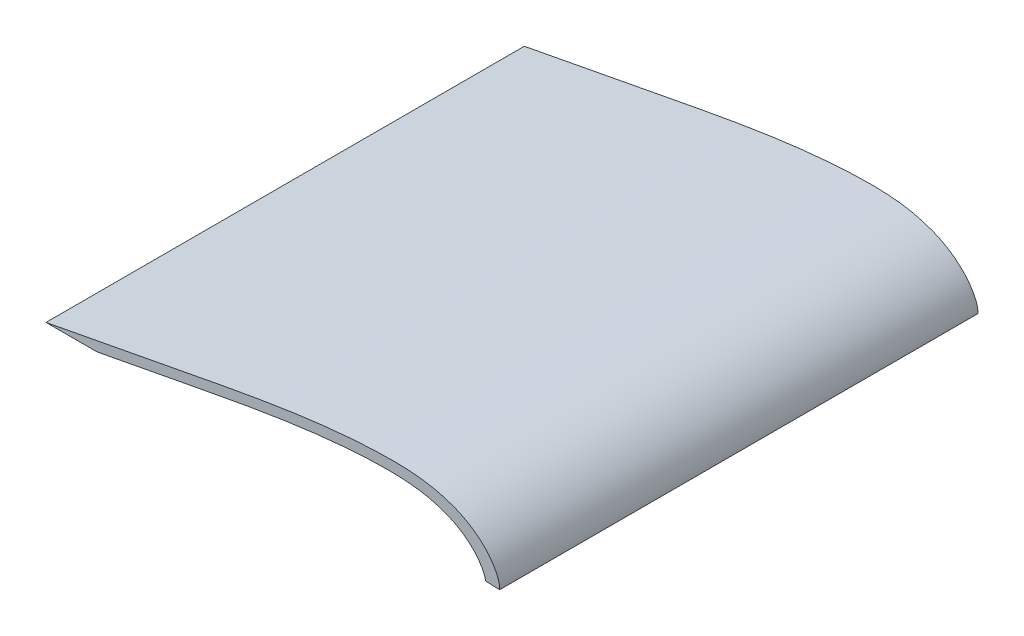
ISO-10303-21;
HEADER;
FILE_DESCRIPTION(('STEP AP214'),'2;1');
FILE_NAME('part.step','',(''),(''),'','','');
FILE_SCHEMA(('AUTOMOTIVE_DESIGN { 1 0 10303 214 1 1 1 1 }'));
ENDSEC;
DATA;
#1=APPLICATION_CONTEXT('core data for automotive mechanical design processes');
#2=APPLICATION_PROTOCOL_DEFINITION('international standard','automotive_design',2000,#1);
#3=PRODUCT_CONTEXT('',#1,'mechanical');
#4=PRODUCT('Part','Part','',(#3));
#5=PRODUCT_RELATED_PRODUCT_CATEGORY('part','',(#4));
#6=PRODUCT_DEFINITION_FORMATION('','',#4);
#7=PRODUCT_DEFINITION_CONTEXT('part definition',#1,'design');
#8=PRODUCT_DEFINITION('design','',#6,#7);
#9=PRODUCT_DEFINITION_SHAPE('','',#8);
#10=(LENGTH_UNIT() NAMED_UNIT(*) SI_UNIT(.MILLI.,.METRE.));
#11=(NAMED_UNIT(*) PLANE_ANGLE_UNIT() SI_UNIT($,.RADIAN.));
#12=(NAMED_UNIT(*) SI_UNIT($,.STERADIAN.) SOLID_ANGLE_UNIT());
#13=UNCERTAINTY_MEASURE_WITH_UNIT(LENGTH_MEASURE(1.E-05),#10,'distance_accuracy_value','');
#14=(GEOMETRIC_REPRESENTATION_CONTEXT(3) GLOBAL_UNCERTAINTY_ASSIGNED_CONTEXT((#13)) GLOBAL_UNIT_ASSIGNED_CONTEXT((#10,
#11,#12)) REPRESENTATION_CONTEXT('',''));
#15=CARTESIAN_POINT('',(0.,0.,0.));
#16=DIRECTION('',(0.,0.,1.));
#17=DIRECTION('',(1.,0.,0.));
#18=AXIS2_PLACEMENT_3D('',#15,#16,#17);
#19=CARTESIAN_POINT('',(0.,0.978621832348302,50.));
#20=DIRECTION('',(0.,-1.,0.));
#21=DIRECTION('',(1.,0.,0.));
#22=AXIS2_PLACEMENT_3D('',#19,#20,#21);
#23=PLANE('',#22);
#24=DIRECTION('',(-1.,0.,0.));
#25=VECTOR('',#24,1.);
#26=CARTESIAN_POINT('',(0.,0.978621832348302,-50.));
#27=LINE('',#26,#25);
#28=CARTESIAN_POINT('',(-35.4155003882221,0.978621832348296,-50.));
#29=VERTEX_POINT('',#28);
#30=CARTESIAN_POINT('',(-46.1269689717631,0.978621832348294,-50.));
#31=VERTEX_POINT('',#30);
#32=EDGE_CURVE('E109',#29,#31,#27,.T.);
#33=ORIENTED_EDGE('',*,*,#32,.F.);
#34=DIRECTION('',(0.,0.,-1.));
#35=VECTOR('',#34,1.);
#36=CARTESIAN_POINT('',(-35.4155003882221,0.978621832348296,50.));
#37=LINE('',#36,#35);
#38=CARTESIAN_POINT('',(-35.4155003882221,0.978621832348296,50.));
#39=VERTEX_POINT('',#38);
#40=EDGE_CURVE('E11',#39,#29,#37,.T.);
#41=ORIENTED_EDGE('',*,*,#40,.F.);
#42=DIRECTION('',(-1.,0.,0.));
#43=VECTOR('',#42,1.);
#44=CARTESIAN_POINT('',(0.,0.978621832348302,50.));
#45=LINE('',#44,#43);
#46=CARTESIAN_POINT('',(-46.1269689717631,0.978621832348294,50.));
#47=VERTEX_POINT('',#46);
#48=EDGE_CURVE('E91',#39,#47,#45,.T.);
#49=ORIENTED_EDGE('',*,*,#48,.T.);
#50=DIRECTION('',(0.,0.,-1.));
#51=VECTOR('',#50,1.);
#52=CARTESIAN_POINT('',(-46.1269689717631,0.978621832348294,50.));
#53=LINE('',#52,#51);
#54=EDGE_CURVE('E80',#47,#31,#53,.T.);
#55=ORIENTED_EDGE('',*,*,#54,.T.);
#56=EDGE_LOOP('',(#33,#41,#49,#55));
#57=FACE_BOUND('',#56,.T.);
#58=ADVANCED_FACE('F41',(#57),#23,.T.);
#59=CARTESIAN_POINT('',(-35.4155003882221,0.978621832348296,50.));
#60=CARTESIAN_POINT('',(-31.9007173370773,1.64635628416153,50.));
#61=CARTESIAN_POINT('',(-28.3856698058971,2.3126448778515,50.));
#62=CARTESIAN_POINT('',(-21.3562508178817,3.64891802505001,50.));
#63=CARTESIAN_POINT('',(-17.8425754911761,4.3227081792385,50.));
#64=CARTESIAN_POINT('',(-10.8122623329176,5.65409308106331,50.));
#65=CARTESIAN_POINT('',(-7.29606650944638,6.3141041962508,50.));
#66=CARTESIAN_POINT('',(-0.246237666937349,7.53880085388031,50.));
#67=CARTESIAN_POINT('',(3.28965238831914,8.10092736864592,50.));
#68=CARTESIAN_POINT('',(10.3825939062802,9.05560755958679,50.));
#69=CARTESIAN_POINT('',(13.9396556372091,9.44993128258674,50.));
#70=CARTESIAN_POINT('',(19.2947793828201,9.84598529877852,50.));
#71=CARTESIAN_POINT('',(21.0805341764407,9.94564859009441,50.));
#72=CARTESIAN_POINT('',(24.6540542042394,10.0538145286358,50.));
#73=CARTESIAN_POINT('',(26.4418124960493,10.0626319679296,50.));
#74=CARTESIAN_POINT('',(29.1266398806134,9.93121440272804,50.));
#75=CARTESIAN_POINT('',(30.0211426646081,9.86253180617185,50.));
#76=CARTESIAN_POINT('',(31.793464097941,9.65608484297072,50.));
#77=CARTESIAN_POINT('',(32.6728326635426,9.51756510191342,50.));
#78=CARTESIAN_POINT('',(34.4149632249248,9.15422751018887,50.));
#79=CARTESIAN_POINT('',(35.2779300317,8.9304739853783,50.));
#80=CARTESIAN_POINT('',(36.5586522207257,8.5235043255177,50.));
#81=CARTESIAN_POINT('',(36.9844848613411,8.3755582260794,50.));
#82=CARTESIAN_POINT('',(37.8234910137626,8.05637966784077,50.));
#83=CARTESIAN_POINT('',(38.6499420382026,7.71337174188249,50.));
#84=CARTESIAN_POINT('',(39.4456058317382,7.31193030195583,50.));
#85=CARTESIAN_POINT('',(40.2226247444065,6.87510127196028,50.));
#86=CARTESIAN_POINT('',(40.6019011367286,6.63916259648856,50.));
#87=CARTESIAN_POINT('',(41.3430348679903,6.13422425015035,50.));
#88=CARTESIAN_POINT('',(41.7065771372966,5.86440325875697,50.));
#89=CARTESIAN_POINT('',(42.4050975818294,5.29900942864422,50.));
#90=CARTESIAN_POINT('',(42.7404354190773,5.00270787099087,50.));
#91=CARTESIAN_POINT('',(43.3790396374764,4.37876524760581,50.));
#92=CARTESIAN_POINT('',(43.6828545053455,4.05166015080139,50.));
#93=CARTESIAN_POINT('',(44.2483702108183,3.35629707072127,50.));
#94=CARTESIAN_POINT('',(44.5091093181837,2.98367906409147,50.));
#95=CARTESIAN_POINT('',(44.864883627484,2.40534334857502,50.));
#96=CARTESIAN_POINT('',(44.9779872625424,2.20959398690504,50.));
#97=CARTESIAN_POINT('',(45.1939946475139,1.81257361418332,50.));
#98=CARTESIAN_POINT('',(45.2964451830852,1.61105725814508,50.));
#99=CARTESIAN_POINT('',(45.4811307024665,1.19708097294938,50.));
#100=CARTESIAN_POINT('',(45.5635723297641,0.983774864354236,50.));
#101=CARTESIAN_POINT('',(45.6905821473474,0.549932416107321,50.));
#102=CARTESIAN_POINT('',(45.7355392161152,0.328490722260033,50.));
#103=CARTESIAN_POINT('',(45.7527208505078,0.100279614292406,50.));
#104=B_SPLINE_CURVE_WITH_KNOTS('',3,(#59,#60,#61,#62,#63,#64,#65,#66,#67,#68,#69,#70,#71,#72,
#73,#74,#75,#76,#77,#78,#79,#80,#81,#82,#83,#84,#85,#86,#87,#88,#89,#90,#91,#92,#93,#94,#95,#96,
#97,#98,#99,#100,#101,#102,#103),.UNSPECIFIED.,.F.,.F.,(4,2,2,2,2,2,2,2,2,2,2,2,1,2,2,2,2,2,2,2,
2,2,4),(0.,0.125,0.25,0.375,0.5,0.625,0.6875,0.75,0.78125,0.8125,0.84375,0.859375,0.875,
0.890625,0.90625,0.921875,0.9375,0.953125,0.96875,0.9765625,0.984375,0.9921875,1.),.UNSPECIFIED.);
#105=DIRECTION('',(0.,0.,-1.));
#106=VECTOR('',#105,1.);
#107=SURFACE_OF_LINEAR_EXTRUSION('',#104,#106);
#108=CARTESIAN_POINT('',(-13.2792701395057,5.18667984495389,-4.89999999999999));
#109=CARTESIAN_POINT('',(-13.5582378660273,5.13397641149939,-4.89998824114871));
#110=CARTESIAN_POINT('',(-13.8373961015732,5.08117268224034,-4.87610393290239));
#111=CARTESIAN_POINT('',(-14.3880719474885,4.97692631034668,-4.78108779745486));
#112=CARTESIAN_POINT('',(-14.6595798550001,4.92548540070697,-4.70989855781385));
#113=CARTESIAN_POINT('',(-15.1869599265857,4.82547865828556,-4.52206002530446));
#114=CARTESIAN_POINT('',(-15.4428338392134,4.77691250400147,-4.40541582706324));
#115=CARTESIAN_POINT('',(-15.9314165585316,4.68411771628761,-4.12974299143327));
#116=CARTESIAN_POINT('',(-16.1641319625704,4.6398878475992,-3.970726472732));
#117=CARTESIAN_POINT('',(-16.5977599840269,4.5574324068113,-3.61600095980994));
#118=CARTESIAN_POINT('',(-16.7989105789687,4.51916192361433,-3.42059351665633));
#119=CARTESIAN_POINT('',(-17.1654534131722,4.44940090664218,-2.99764418007407));
#120=CARTESIAN_POINT('',(-17.330847349518,4.41791005109233,-2.77010381258746));
#121=CARTESIAN_POINT('',(-17.6181744332678,4.36319137106151,-2.29347619149444));
#122=CARTESIAN_POINT('',(-17.7407960541633,4.3398326627328,-2.04481901367112));
#123=CARTESIAN_POINT('',(-17.9425337067278,4.30139817703947,-1.52984417542433));
#124=CARTESIAN_POINT('',(-18.0216541422941,4.28632156122694,-1.26352830576077));
#125=CARTESIAN_POINT('',(-18.1329546371241,4.26511197076907,-0.725312577544871));
#126=CARTESIAN_POINT('',(-18.1658549157874,4.25884177172993,-0.453566898115503));
#127=CARTESIAN_POINT('',(-18.186000808098,4.25500239398807,0.0916655325322689));
#128=CARTESIAN_POINT('',(-18.1732490733454,4.25743270993444,0.365152181709126));
#129=CARTESIAN_POINT('',(-18.1027670013263,4.27086462734465,0.903968829614987));
#130=CARTESIAN_POINT('',(-18.0453713747227,4.2818024451149,1.1693443177488));
#131=CARTESIAN_POINT('',(-17.8877996977759,4.31182632936758,1.68657891053517));
#132=CARTESIAN_POINT('',(-17.7876233623127,4.33091245015588,1.93843792509209));
#133=CARTESIAN_POINT('',(-17.5470598654508,4.37673543150041,2.42267617209285));
#134=CARTESIAN_POINT('',(-17.4065106116814,4.40350313223904,2.65497189858349));
#135=CARTESIAN_POINT('',(-17.0895777474768,4.46384327370599,3.09266504863448));
#136=CARTESIAN_POINT('',(-16.9131919728226,4.49741612540686,3.29806084643685));
#137=CARTESIAN_POINT('',(-16.5270800105377,4.570874469002,3.67917228197775));
#138=CARTESIAN_POINT('',(-16.3169321456056,4.61083976812489,3.85444520171077));
#139=CARTESIAN_POINT('',(-15.8711156552545,4.69557300251991,4.16731551927659));
#140=CARTESIAN_POINT('',(-15.6354447519018,4.74034136646272,4.30490955039136));
#141=CARTESIAN_POINT('',(-15.1409109015208,4.83421190515628,4.54099657275173));
#142=CARTESIAN_POINT('',(-14.881718051139,4.8833755107241,4.63877422307195));
#143=CARTESIAN_POINT('',(-14.3509880406559,4.98395320345979,4.78931345196921));
#144=CARTESIAN_POINT('',(-14.0794498709428,5.03536747467636,4.84207134178829));
#145=CARTESIAN_POINT('',(-13.5278459318931,5.13971727020196,4.90165100845156));
#146=CARTESIAN_POINT('',(-13.2477146675762,5.19266394535014,4.90784842739502));
#147=CARTESIAN_POINT('',(-12.6903411741331,5.29786458421039,4.87248894222003));
#148=CARTESIAN_POINT('',(-12.4130990566631,5.35011852117146,4.83093019933692));
#149=CARTESIAN_POINT('',(-11.8683560659781,5.45261360959477,4.70085264401336));
#150=CARTESIAN_POINT('',(-11.6008941303717,5.50284678162927,4.61216421706125));
#151=CARTESIAN_POINT('',(-11.0845356329764,5.59963428981457,4.39000301833081));
#152=CARTESIAN_POINT('',(-10.8356385350834,5.6461887321998,4.25653154038265));
#153=CARTESIAN_POINT('',(-10.3656858371074,5.7339071810612,3.94957854313736));
#154=CARTESIAN_POINT('',(-10.1444253668393,5.77511095530248,3.7764222366728));
#155=CARTESIAN_POINT('',(-9.73416794451757,5.85135747256019,3.394233835991));
#156=CARTESIAN_POINT('',(-9.54516835180756,5.88640071984254,3.18520468089291));
#157=CARTESIAN_POINT('',(-9.20799094239719,5.94880826487042,2.74067472167256));
#158=CARTESIAN_POINT('',(-9.05922238021198,5.9762838111547,2.50563766971706));
#159=CARTESIAN_POINT('',(-8.80332547353379,6.02348111623782,2.01318028895523));
#160=CARTESIAN_POINT('',(-8.69619313035803,6.04320361962988,1.75576211250714));
#161=CARTESIAN_POINT('',(-8.52834638876151,6.0740780589275,1.23028028638847));
#162=CARTESIAN_POINT('',(-8.4669179145678,6.0853618560177,0.962452342869722));
#163=CARTESIAN_POINT('',(-8.38963368904596,6.09955515729526,0.420087256604169));
#164=CARTESIAN_POINT('',(-8.37377500106707,6.10246520111186,0.145550547339863));
#165=CARTESIAN_POINT('',(-8.38805942457665,6.09984294334618,-0.399639390175988));
#166=CARTESIAN_POINT('',(-8.41776356539655,6.09439120260348,-0.670304634342462));
#167=CARTESIAN_POINT('',(-8.52143221268221,6.07534547004839,-1.20271735496028));
#168=CARTESIAN_POINT('',(-8.59539622444414,6.06175156924301,-1.4644649310521));
#169=CARTESIAN_POINT('',(-8.78534111810889,6.0267887633809,-1.97180241538893));
#170=CARTESIAN_POINT('',(-8.90133985737986,6.0054165538939,-2.21738540405341));
#171=CARTESIAN_POINT('',(-9.17182938833109,5.95548509817186,-2.68551969672683));
#172=CARTESIAN_POINT('',(-9.32632017380358,5.92692585309592,-2.90807100445018));
#173=CARTESIAN_POINT('',(-9.6709530275643,5.86307929115366,-3.32628922403478));
#174=CARTESIAN_POINT('',(-9.86143549555745,5.8277276750546,-3.52166567569352));
#175=CARTESIAN_POINT('',(-10.2715240965625,5.75144604211911,-3.87778787476842));
#176=CARTESIAN_POINT('',(-10.4911396112656,5.71051422817802,-4.03852242253124));
#177=CARTESIAN_POINT('',(-10.9570177325765,5.62349186671397,-4.3235351484654));
#178=CARTESIAN_POINT('',(-11.2036582058446,5.57732774026196,-4.44717237809415));
#179=CARTESIAN_POINT('',(-11.7134004671176,5.4817232353523,-4.65115779503187));
#180=CARTESIAN_POINT('',(-11.9764841228919,5.43228646226929,-4.73155275820307));
#181=CARTESIAN_POINT('',(-12.4141314734336,5.34990617184319,-4.82616564345606));
#182=CARTESIAN_POINT('',(-12.5860131095919,5.31751795157748,-4.85382337844951));
#183=CARTESIAN_POINT('',(-12.9316618715679,5.2523260877219,-4.89074430984593));
#184=CARTESIAN_POINT('',(-13.1054290156781,5.21952244010117,-4.9000073276287));
#185=CARTESIAN_POINT('',(-13.2792701395057,5.18667984495389,-4.89999999999999));
#186=B_SPLINE_CURVE_WITH_KNOTS('',3,(#108,#109,#110,#111,#112,#113,#114,#115,#116,#117,#118,
#119,#120,#121,#122,#123,#124,#125,#126,#127,#128,#129,#130,#131,#132,#133,#134,#135,#136,#137,
#138,#139,#140,#141,#142,#143,#144,#145,#146,#147,#148,#149,#150,#151,#152,#153,#154,#155,#156,
#157,#158,#159,#160,#161,#162,#163,#164,#165,#166,#167,#168,#169,#170,#171,#172,#173,#174,#175,
#176,#177,#178,#179,#180,#181,#182,#183,#184,#185),.UNSPECIFIED.,.T.,.F.,(4,2,2,2,2,2,2,2,2,2,2,
2,2,2,2,2,2,2,2,2,2,2,2,2,2,2,2,2,2,2,2,2,2,2,2,2,2,2,4),(0.,0.851066972016037,1.70316874720835,
2.55517504562554,3.40693792720399,4.25193373195981,5.09688942267957,5.92753804166074,
6.75810255339284,7.57557567140816,8.39300130900654,9.20435680969015,10.0157177178878,
10.8303827951912,11.6450970859203,12.4709163857348,13.2968094508408,14.1369473850339,
14.977154150513,15.8286079888824,16.6800946120406,17.5346666034676,18.3892139075228,
19.2369939856707,20.0847046369897,20.9191929264346,21.7536010530046,22.5746816572003,
23.3957093473655,24.2088764632463,25.022034490321,25.835538372342,26.6490421231658,
27.470664322854,28.2925517540978,29.1279148482882,29.9623724900299,30.492717000037,
31.0230666598799),.UNSPECIFIED.);
#187=CARTESIAN_POINT('',(-13.2792701395057,5.18667984495389,-4.89999999999999));
#188=VERTEX_POINT('',#187);
#189=EDGE_CURVE('E130',#188,#188,#186,.T.);
#190=ORIENTED_EDGE('',*,*,#189,.T.);
#191=EDGE_LOOP('',(#190));
#192=FACE_BOUND('',#191,.T.);
#193=CARTESIAN_POINT('',(-35.4155003882221,0.978621832348296,-50.));
#194=CARTESIAN_POINT('',(-31.9007173370773,1.64635628416153,-50.));
#195=CARTESIAN_POINT('',(-28.3856698058971,2.3126448778515,-50.));
#196=CARTESIAN_POINT('',(-21.3562508178817,3.64891802505001,-50.));
#197=CARTESIAN_POINT('',(-17.8425754911761,4.3227081792385,-50.));
#198=CARTESIAN_POINT('',(-10.8122623329176,5.65409308106331,-50.));
#199=CARTESIAN_POINT('',(-7.29606650944638,6.3141041962508,-50.));
#200=CARTESIAN_POINT('',(-0.246237666937349,7.53880085388031,-50.));
#201=CARTESIAN_POINT('',(3.28965238831914,8.10092736864592,-50.));
#202=CARTESIAN_POINT('',(10.3825939062802,9.05560755958679,-50.));
#203=CARTESIAN_POINT('',(13.9396556372091,9.44993128258674,-50.));
#204=CARTESIAN_POINT('',(19.2947793828201,9.84598529877852,-50.));
#205=CARTESIAN_POINT('',(21.0805341764407,9.94564859009441,-50.));
#206=CARTESIAN_POINT('',(24.6540542042394,10.0538145286358,-50.));
#207=CARTESIAN_POINT('',(26.4418124960493,10.0626319679296,-50.));
#208=CARTESIAN_POINT('',(29.1266398806134,9.93121440272804,-50.));
#209=CARTESIAN_POINT('',(30.0211426646081,9.86253180617185,-50.));
#210=CARTESIAN_POINT('',(31.793464097941,9.65608484297072,-50.));
#211=CARTESIAN_POINT('',(32.6728326635426,9.51756510191342,-50.));
#212=CARTESIAN_POINT('',(34.4149632249248,9.15422751018887,-50.));
#213=CARTESIAN_POINT('',(35.2779300317,8.9304739853783,-50.));
#214=CARTESIAN_POINT('',(36.5586522207257,8.5235043255177,-50.));
#215=CARTESIAN_POINT('',(36.9844848613411,8.3755582260794,-50.));
#216=CARTESIAN_POINT('',(37.8234910137626,8.05637966784077,-50.));
#217=CARTESIAN_POINT('',(38.6499420382026,7.71337174188249,-50.));
#218=CARTESIAN_POINT('',(39.4456058317382,7.31193030195583,-50.));
#219=CARTESIAN_POINT('',(40.2226247444065,6.87510127196028,-50.));
#220=CARTESIAN_POINT('',(40.6019011367286,6.63916259648856,-50.));
#221=CARTESIAN_POINT('',(41.3430348679903,6.13422425015035,-50.));
#222=CARTESIAN_POINT('',(41.7065771372966,5.86440325875697,-50.));
#223=CARTESIAN_POINT('',(42.4050975818294,5.29900942864422,-50.));
#224=CARTESIAN_POINT('',(42.7404354190773,5.00270787099087,-50.));
#225=CARTESIAN_POINT('',(43.3790396374764,4.37876524760581,-50.));
#226=CARTESIAN_POINT('',(43.6828545053455,4.05166015080139,-50.));
#227=CARTESIAN_POINT('',(44.2483702108183,3.35629707072127,-50.));
#228=CARTESIAN_POINT('',(44.5091093181837,2.98367906409147,-50.));
#229=CARTESIAN_POINT('',(44.864883627484,2.40534334857502,-50.));
#230=CARTESIAN_POINT('',(44.9779872625424,2.20959398690504,-50.));
#231=CARTESIAN_POINT('',(45.1939946475139,1.81257361418332,-50.));
#232=CARTESIAN_POINT('',(45.2964451830852,1.61105725814508,-50.));
#233=CARTESIAN_POINT('',(45.4811307024665,1.19708097294938,-50.));
#234=CARTESIAN_POINT('',(45.5635723297641,0.983774864354236,-50.));
#235=CARTESIAN_POINT('',(45.6905821473474,0.549932416107321,-50.));
#236=CARTESIAN_POINT('',(45.7355392161152,0.328490722260033,-50.));
#237=CARTESIAN_POINT('',(45.7527208505078,0.100279614292406,-50.));
#238=B_SPLINE_CURVE_WITH_KNOTS('',3,(#193,#194,#195,#196,#197,#198,#199,#200,#201,#202,#203,
#204,#205,#206,#207,#208,#209,#210,#211,#212,#213,#214,#215,#216,#217,#218,#219,#220,#221,#222,
#223,#224,#225,#226,#227,#228,#229,#230,#231,#232,#233,#234,#235,#236,#237),.UNSPECIFIED.,.F.,
.F.,(4,2,2,2,2,2,2,2,2,2,2,2,1,2,2,2,2,2,2,2,2,2,4),(0.,0.125,0.25,0.375,0.5,0.625,0.6875,0.75,
0.78125,0.8125,0.84375,0.859375,0.875,0.890625,0.90625,0.921875,0.9375,0.953125,0.96875,
0.9765625,0.984375,0.9921875,1.),.UNSPECIFIED.);
#239=CARTESIAN_POINT('',(45.7527208505078,0.100279614292406,-50.));
#240=VERTEX_POINT('',#239);
#241=EDGE_CURVE('E96',#29,#240,#238,.T.);
#242=ORIENTED_EDGE('',*,*,#241,.T.);
#243=DIRECTION('',(0.,0.,-1.));
#244=VECTOR('',#243,1.);
#245=CARTESIAN_POINT('',(45.7527208505078,0.100279614292406,50.));
#246=LINE('',#245,#244);
#247=CARTESIAN_POINT('',(45.7527208505078,0.100279614292406,50.));
#248=VERTEX_POINT('',#247);
#249=EDGE_CURVE('E49',#248,#240,#246,.T.);
#250=ORIENTED_EDGE('',*,*,#249,.F.);
#251=EDGE_CURVE('E86',#39,#248,#104,.T.);
#252=ORIENTED_EDGE('',*,*,#251,.F.);
#253=ORIENTED_EDGE('',*,*,#40,.T.);
#254=EDGE_LOOP('',(#242,#250,#252,#253));
#255=FACE_BOUND('',#254,.T.);
#256=ADVANCED_FACE('F94',(#192,#255),#107,.F.);
#257=CARTESIAN_POINT('',(0.0555537243133296,1.64424200734838,50.));
#258=DIRECTION('',(0.0337675612923491,0.999429713288717,0.));
#259=DIRECTION('',(-0.999429713288717,0.0337675612923491,0.));
#260=AXIS2_PLACEMENT_3D('',#257,#258,#259);
#261=PLANE('',#260);
#262=DIRECTION('',(0.999429713288717,-0.0337675612923491,0.));
#263=VECTOR('',#262,1.);
#264=CARTESIAN_POINT('',(0.0555537243133296,1.64424200734838,-50.));
#265=LINE('',#264,#263);
#266=CARTESIAN_POINT('',(48.7207298604943,0.,-50.));
#267=VERTEX_POINT('',#266);
#268=EDGE_CURVE('E73',#240,#267,#265,.T.);
#269=ORIENTED_EDGE('',*,*,#268,.T.);
#270=DIRECTION('',(0.,0.,-1.));
#271=VECTOR('',#270,1.);
#272=CARTESIAN_POINT('',(48.7207298604943,0.,50.));
#273=LINE('',#272,#271);
#274=CARTESIAN_POINT('',(48.7207298604943,0.,50.));
#275=VERTEX_POINT('',#274);
#276=EDGE_CURVE('E97',#275,#267,#273,.T.);
#277=ORIENTED_EDGE('',*,*,#276,.F.);
#278=DIRECTION('',(0.999429713288717,-0.0337675612923491,0.));
#279=VECTOR('',#278,1.);
#280=CARTESIAN_POINT('',(0.0555537243133296,1.64424200734838,50.));
#281=LINE('',#280,#279);
#282=EDGE_CURVE('E90',#248,#275,#281,.T.);
#283=ORIENTED_EDGE('',*,*,#282,.F.);
#284=ORIENTED_EDGE('',*,*,#249,.T.);
#285=EDGE_LOOP('',(#269,#277,#283,#284));
#286=FACE_BOUND('',#285,.T.);
#287=ADVANCED_FACE('F98',(#286),#261,.F.);
#288=CARTESIAN_POINT('',(48.7207298604943,0.,50.));
#289=CARTESIAN_POINT('',(48.741252965423,1.21195926307834,50.));
#290=CARTESIAN_POINT('',(48.0463572006375,2.85721534173638,50.));
#291=CARTESIAN_POINT('',(46.8151058611346,4.78389107983521,50.));
#292=CARTESIAN_POINT('',(45.4925176332466,6.30238205119,50.));
#293=CARTESIAN_POINT('',(43.8268432539271,7.74081065836544,50.));
#294=CARTESIAN_POINT('',(41.4946226029745,9.26430075591071,50.));
#295=CARTESIAN_POINT('',(38.168076464808,10.7171785821723,50.));
#296=CARTESIAN_POINT('',(33.7886927897657,11.8315306531659,50.));
#297=CARTESIAN_POINT('',(28.7294325889155,12.2558988315068,50.));
#298=CARTESIAN_POINT('',(23.7170466796589,12.2188082758978,50.));
#299=CARTESIAN_POINT('',(17.0390176954906,11.8575866468183,50.));
#300=CARTESIAN_POINT('',(8.69027623430045,10.9742714344733,50.));
#301=CARTESIAN_POINT('',(-1.3040851260052,9.44788699290187,50.));
#302=CARTESIAN_POINT('',(-11.2876607345756,7.61115292207958,50.));
#303=CARTESIAN_POINT('',(-21.2786207253422,5.6967215857554,50.));
#304=CARTESIAN_POINT('',(-34.6130364156148,3.16885227616305,50.));
#305=CARTESIAN_POINT('',(-44.6123870014512,1.26557386191845,50.));
#306=CARTESIAN_POINT('',(-51.2792701395057,0.,50.));
#307=B_SPLINE_CURVE_WITH_KNOTS('',3,(#288,#289,#290,#291,#292,#293,#294,#295,#296,#297,#298,
#299,#300,#301,#302,#303,#304,#305,#306),.UNSPECIFIED.,.F.,.F.,(4,1,1,1,1,1,1,1,1,1,1,1,1,1,1,1,
4),(0.,0.0326267587867305,0.0498828709177647,0.0642758902282802,0.0892508134624014,
0.111667997889211,0.142584384450054,0.19113550060581,0.23834039164428,0.285329254589513,
0.332381603589846,0.426846936625918,0.521876030882482,0.617364059993791,0.713023044995343,
0.808682029996895,1.),.UNSPECIFIED.);
#308=DIRECTION('',(0.,0.,-1.));
#309=VECTOR('',#308,1.);
#310=SURFACE_OF_LINEAR_EXTRUSION('',#307,#309);
#311=CARTESIAN_POINT('',(48.7207298604943,0.,-50.));
#312=CARTESIAN_POINT('',(48.741252965423,1.21195926307834,-50.));
#313=CARTESIAN_POINT('',(48.0463572006375,2.85721534173638,-50.));
#314=CARTESIAN_POINT('',(46.8151058611346,4.78389107983521,-50.));
#315=CARTESIAN_POINT('',(45.4925176332466,6.30238205119,-50.));
#316=CARTESIAN_POINT('',(43.8268432539271,7.74081065836544,-50.));
#317=CARTESIAN_POINT('',(41.4946226029745,9.26430075591071,-50.));
#318=CARTESIAN_POINT('',(38.168076464808,10.7171785821723,-50.));
#319=CARTESIAN_POINT('',(33.7886927897657,11.8315306531659,-50.));
#320=CARTESIAN_POINT('',(28.7294325889155,12.2558988315068,-50.));
#321=CARTESIAN_POINT('',(23.7170466796589,12.2188082758978,-50.));
#322=CARTESIAN_POINT('',(17.0390176954906,11.8575866468183,-50.));
#323=CARTESIAN_POINT('',(8.69027623430045,10.9742714344733,-50.));
#324=CARTESIAN_POINT('',(-1.3040851260052,9.44788699290187,-50.));
#325=CARTESIAN_POINT('',(-11.2876607345756,7.61115292207958,-50.));
#326=CARTESIAN_POINT('',(-21.2786207253422,5.6967215857554,-50.));
#327=CARTESIAN_POINT('',(-34.6130364156148,3.16885227616305,-50.));
#328=CARTESIAN_POINT('',(-44.6123870014512,1.26557386191845,-50.));
#329=CARTESIAN_POINT('',(-51.2792701395057,0.,-50.));
#330=B_SPLINE_CURVE_WITH_KNOTS('',3,(#311,#312,#313,#314,#315,#316,#317,#318,#319,#320,#321,
#322,#323,#324,#325,#326,#327,#328,#329),.UNSPECIFIED.,.F.,.F.,(4,1,1,1,1,1,1,1,1,1,1,1,1,1,1,1,
4),(0.,0.0326267587867305,0.0498828709177647,0.0642758902282802,0.0892508134624014,
0.111667997889211,0.142584384450054,0.19113550060581,0.23834039164428,0.285329254589513,
0.332381603589846,0.426846936625918,0.521876030882482,0.617364059993791,0.713023044995343,
0.808682029996895,1.),.UNSPECIFIED.);
#331=EDGE_CURVE('E164',#267,#31,#330,.T.);
#332=ORIENTED_EDGE('',*,*,#331,.T.);
#333=ORIENTED_EDGE('',*,*,#54,.F.);
#334=EDGE_CURVE('E57',#275,#47,#307,.T.);
#335=ORIENTED_EDGE('',*,*,#334,.F.);
#336=ORIENTED_EDGE('',*,*,#276,.T.);
#337=EDGE_LOOP('',(#332,#333,#335,#336));
#338=FACE_BOUND('',#337,.T.);
#339=ADVANCED_FACE('F115',(#338),#310,.F.);
#340=CARTESIAN_POINT('',(0.,0.,50.));
#341=DIRECTION('',(0.,0.,1.));
#342=DIRECTION('',(1.,0.,0.));
#343=AXIS2_PLACEMENT_3D('',#340,#341,#342);
#344=PLANE('',#343);
#345=ORIENTED_EDGE('',*,*,#48,.F.);
#346=ORIENTED_EDGE('',*,*,#251,.T.);
#347=ORIENTED_EDGE('',*,*,#282,.T.);
#348=ORIENTED_EDGE('',*,*,#334,.T.);
#349=EDGE_LOOP('',(#345,#346,#347,#348));
#350=FACE_BOUND('',#349,.T.);
#351=ADVANCED_FACE('F88',(#350),#344,.T.);
#352=CARTESIAN_POINT('',(0.,0.,-50.));
#353=DIRECTION('',(0.,0.,1.));
#354=DIRECTION('',(1.,0.,0.));
#355=AXIS2_PLACEMENT_3D('',#352,#353,#354);
#356=PLANE('',#355);
#357=ORIENTED_EDGE('',*,*,#32,.T.);
#358=ORIENTED_EDGE('',*,*,#331,.F.);
#359=ORIENTED_EDGE('',*,*,#268,.F.);
#360=ORIENTED_EDGE('',*,*,#241,.F.);
#361=EDGE_LOOP('',(#357,#358,#359,#360));
#362=FACE_BOUND('',#361,.T.);
#363=ADVANCED_FACE('F120',(#362),#356,.F.);
#364=CARTESIAN_POINT('',(-13.2792701395057,-0.46,0.));
#365=DIRECTION('',(0.,1.,0.));
#366=DIRECTION('',(0.,0.,1.));
#367=AXIS2_PLACEMENT_3D('',#364,#365,#366);
#368=CYLINDRICAL_SURFACE('',#367,4.9);
#369=CARTESIAN_POINT('',(-13.2792701395057,-0.46,0.));
#370=DIRECTION('',(0.,1.,0.));
#371=DIRECTION('',(0.,0.,1.));
#372=AXIS2_PLACEMENT_3D('',#369,#370,#371);
#373=CIRCLE('',#372,4.9);
#374=CARTESIAN_POINT('',(-13.2792701395057,-0.46,4.90000000000001));
#375=VERTEX_POINT('',#374);
#376=EDGE_CURVE('E132',#375,#375,#373,.T.);
#377=ORIENTED_EDGE('',*,*,#376,.T.);
#378=EDGE_LOOP('',(#377));
#379=FACE_BOUND('',#378,.T.);
#380=ORIENTED_EDGE('',*,*,#189,.F.);
#381=EDGE_LOOP('',(#380));
#382=FACE_BOUND('',#381,.T.);
#383=ADVANCED_FACE('F151',(#379,#382),#368,.T.);
#384=CARTESIAN_POINT('',(0.,-0.46,0.));
#385=DIRECTION('',(0.,1.,0.));
#386=DIRECTION('',(0.,0.,1.));
#387=AXIS2_PLACEMENT_3D('',#384,#385,#386);
#388=PLANE('',#387);
#389=ORIENTED_EDGE('',*,*,#376,.F.);
#390=EDGE_LOOP('',(#389));
#391=FACE_BOUND('',#390,.T.);
#392=ADVANCED_FACE('F148',(#391),#388,.F.);
#393=CLOSED_SHELL('',(#58,#256,#287,#339,#351,#363,#383,#392));
#394=MANIFOLD_SOLID_BREP('B2',#393);
#395=ADVANCED_BREP_SHAPE_REPRESENTATION('',(#18,#394),#14);
#396=SHAPE_DEFINITION_REPRESENTATION(#9,#395);
ENDSEC;
END-ISO-10303-21;
